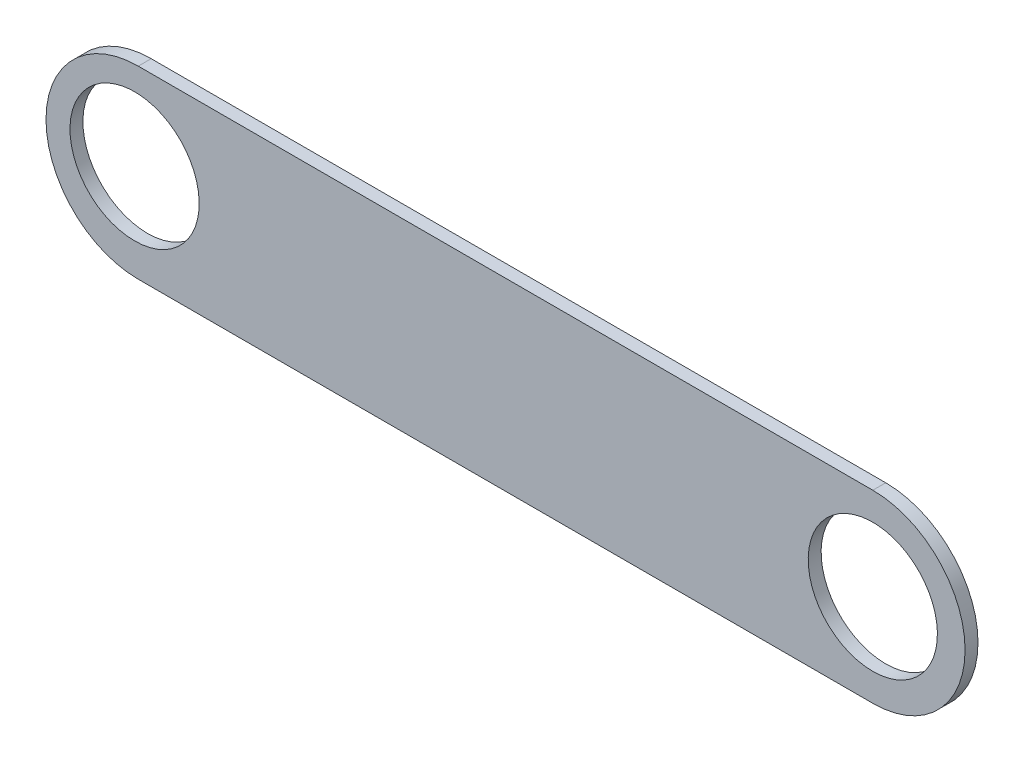
ISO-10303-21;
HEADER;
FILE_DESCRIPTION(('STEP AP214'),'2;1');
FILE_NAME('part.step','',(''),(''),'','','');
FILE_SCHEMA(('AUTOMOTIVE_DESIGN { 1 0 10303 214 1 1 1 1 }'));
ENDSEC;
DATA;
#1=APPLICATION_CONTEXT('core data for automotive mechanical design processes');
#2=APPLICATION_PROTOCOL_DEFINITION('international standard','automotive_design',2000,#1);
#3=PRODUCT_CONTEXT('',#1,'mechanical');
#4=PRODUCT('Part','Part','',(#3));
#5=PRODUCT_RELATED_PRODUCT_CATEGORY('part','',(#4));
#6=PRODUCT_DEFINITION_FORMATION('','',#4);
#7=PRODUCT_DEFINITION_CONTEXT('part definition',#1,'design');
#8=PRODUCT_DEFINITION('design','',#6,#7);
#9=PRODUCT_DEFINITION_SHAPE('','',#8);
#10=(LENGTH_UNIT() NAMED_UNIT(*) SI_UNIT(.MILLI.,.METRE.));
#11=(NAMED_UNIT(*) PLANE_ANGLE_UNIT() SI_UNIT($,.RADIAN.));
#12=(NAMED_UNIT(*) SI_UNIT($,.STERADIAN.) SOLID_ANGLE_UNIT());
#13=UNCERTAINTY_MEASURE_WITH_UNIT(LENGTH_MEASURE(1.E-05),#10,'distance_accuracy_value','');
#14=(GEOMETRIC_REPRESENTATION_CONTEXT(3) GLOBAL_UNCERTAINTY_ASSIGNED_CONTEXT((#13)) GLOBAL_UNIT_ASSIGNED_CONTEXT((#10,
#11,#12)) REPRESENTATION_CONTEXT('',''));
#15=CARTESIAN_POINT('',(0.,0.,0.));
#16=DIRECTION('',(0.,0.,1.));
#17=DIRECTION('',(1.,0.,0.));
#18=AXIS2_PLACEMENT_3D('',#15,#16,#17);
#19=CARTESIAN_POINT('',(95.66,-96.25,-0.045));
#20=DIRECTION('',(0.,0.,-1.));
#21=DIRECTION('',(0.,-1.,0.));
#22=AXIS2_PLACEMENT_3D('',#19,#20,#21);
#23=CYLINDRICAL_SURFACE('',#22,0.175);
#24=CARTESIAN_POINT('',(95.66,-96.25,-0.035));
#25=DIRECTION('',(0.,0.,-1.));
#26=DIRECTION('',(0.,-1.,0.));
#27=AXIS2_PLACEMENT_3D('',#24,#25,#26);
#28=CIRCLE('',#27,0.175);
#29=CARTESIAN_POINT('',(95.66,-96.425,-0.035));
#30=VERTEX_POINT('',#29);
#31=EDGE_CURVE('E132',#30,#30,#28,.T.);
#32=ORIENTED_EDGE('',*,*,#31,.T.);
#33=DIRECTION('',(0.,0.,1.));
#34=VECTOR('',#33,1.);
#35=CARTESIAN_POINT('',(95.66,-96.425,-0.045));
#36=LINE('',#35,#34);
#37=CARTESIAN_POINT('',(95.66,-96.425,0.));
#38=VERTEX_POINT('',#37);
#39=EDGE_CURVE('E11',#30,#38,#36,.T.);
#40=ORIENTED_EDGE('',*,*,#39,.T.);
#41=CARTESIAN_POINT('',(95.66,-96.25,0.));
#42=DIRECTION('',(0.,0.,-1.));
#43=DIRECTION('',(0.,-1.,0.));
#44=AXIS2_PLACEMENT_3D('',#41,#42,#43);
#45=CIRCLE('',#44,0.175);
#46=EDGE_CURVE('E135',#38,#38,#45,.T.);
#47=ORIENTED_EDGE('',*,*,#46,.F.);
#48=ORIENTED_EDGE('',*,*,#39,.F.);
#49=EDGE_LOOP('',(#32,#40,#47,#48));
#50=FACE_BOUND('',#49,.T.);
#51=ADVANCED_FACE('F17',(#50),#23,.F.);
#52=CARTESIAN_POINT('',(97.66,-96.26,-0.045));
#53=DIRECTION('',(0.,0.,-1.));
#54=DIRECTION('',(0.,-1.,0.));
#55=AXIS2_PLACEMENT_3D('',#52,#53,#54);
#56=CYLINDRICAL_SURFACE('',#55,0.175);
#57=CARTESIAN_POINT('',(97.66,-96.26,-0.035));
#58=DIRECTION('',(0.,0.,-1.));
#59=DIRECTION('',(0.,-1.,0.));
#60=AXIS2_PLACEMENT_3D('',#57,#58,#59);
#61=CIRCLE('',#60,0.175);
#62=CARTESIAN_POINT('',(97.66,-96.435,-0.035));
#63=VERTEX_POINT('',#62);
#64=EDGE_CURVE('E147',#63,#63,#61,.T.);
#65=ORIENTED_EDGE('',*,*,#64,.T.);
#66=DIRECTION('',(0.,0.,1.));
#67=VECTOR('',#66,1.);
#68=CARTESIAN_POINT('',(97.66,-96.435,-0.045));
#69=LINE('',#68,#67);
#70=CARTESIAN_POINT('',(97.66,-96.435,0.));
#71=VERTEX_POINT('',#70);
#72=EDGE_CURVE('E26',#63,#71,#69,.T.);
#73=ORIENTED_EDGE('',*,*,#72,.T.);
#74=CARTESIAN_POINT('',(97.66,-96.26,0.));
#75=DIRECTION('',(0.,0.,-1.));
#76=DIRECTION('',(0.,-1.,0.));
#77=AXIS2_PLACEMENT_3D('',#74,#75,#76);
#78=CIRCLE('',#77,0.175);
#79=EDGE_CURVE('E131',#71,#71,#78,.T.);
#80=ORIENTED_EDGE('',*,*,#79,.F.);
#81=ORIENTED_EDGE('',*,*,#72,.F.);
#82=EDGE_LOOP('',(#65,#73,#80,#81));
#83=FACE_BOUND('',#82,.T.);
#84=ADVANCED_FACE('F19',(#83),#56,.F.);
#85=CARTESIAN_POINT('',(95.67,-96.51,-0.035));
#86=DIRECTION('',(0.,1.,0.));
#87=DIRECTION('',(1.,0.,0.));
#88=AXIS2_PLACEMENT_3D('',#85,#86,#87);
#89=PLANE('',#88);
#90=DIRECTION('',(1.,0.,0.));
#91=VECTOR('',#90,1.);
#92=CARTESIAN_POINT('',(95.67,-96.51,-0.035));
#93=LINE('',#92,#91);
#94=CARTESIAN_POINT('',(95.67,-96.51,-0.035));
#95=VERTEX_POINT('',#94);
#96=CARTESIAN_POINT('',(97.66,-96.51,-0.035));
#97=VERTEX_POINT('',#96);
#98=EDGE_CURVE('E151',#95,#97,#93,.T.);
#99=ORIENTED_EDGE('',*,*,#98,.T.);
#100=DIRECTION('',(0.,0.,1.));
#101=VECTOR('',#100,1.);
#102=CARTESIAN_POINT('',(97.66,-96.51,-0.035));
#103=LINE('',#102,#101);
#104=CARTESIAN_POINT('',(97.66,-96.51,0.));
#105=VERTEX_POINT('',#104);
#106=EDGE_CURVE('E96',#97,#105,#103,.T.);
#107=ORIENTED_EDGE('',*,*,#106,.T.);
#108=DIRECTION('',(1.,0.,0.));
#109=VECTOR('',#108,1.);
#110=CARTESIAN_POINT('',(95.67,-96.51,0.));
#111=LINE('',#110,#109);
#112=CARTESIAN_POINT('',(95.67,-96.51,0.));
#113=VERTEX_POINT('',#112);
#114=EDGE_CURVE('E128',#113,#105,#111,.T.);
#115=ORIENTED_EDGE('',*,*,#114,.F.);
#116=DIRECTION('',(0.,0.,1.));
#117=VECTOR('',#116,1.);
#118=CARTESIAN_POINT('',(95.67,-96.51,-0.035));
#119=LINE('',#118,#117);
#120=EDGE_CURVE('E140',#95,#113,#119,.T.);
#121=ORIENTED_EDGE('',*,*,#120,.F.);
#122=EDGE_LOOP('',(#99,#107,#115,#121));
#123=FACE_BOUND('',#122,.T.);
#124=ADVANCED_FACE('F258',(#123),#89,.F.);
#125=CARTESIAN_POINT('',(97.66,-96.01,0.));
#126=DIRECTION('',(0.,0.,1.));
#127=DIRECTION('',(1.,0.,0.));
#128=AXIS2_PLACEMENT_3D('',#125,#126,#127);
#129=PLANE('',#128);
#130=ORIENTED_EDGE('',*,*,#46,.T.);
#131=EDGE_LOOP('',(#130));
#132=FACE_BOUND('',#131,.T.);
#133=ORIENTED_EDGE('',*,*,#79,.T.);
#134=EDGE_LOOP('',(#133));
#135=FACE_BOUND('',#134,.T.);
#136=DIRECTION('',(-1.,0.,0.));
#137=VECTOR('',#136,1.);
#138=CARTESIAN_POINT('',(97.66,-96.01,0.));
#139=LINE('',#138,#137);
#140=CARTESIAN_POINT('',(97.66,-96.01,0.));
#141=VERTEX_POINT('',#140);
#142=CARTESIAN_POINT('',(95.67,-96.01,0.));
#143=VERTEX_POINT('',#142);
#144=EDGE_CURVE('E108',#141,#143,#139,.T.);
#145=ORIENTED_EDGE('',*,*,#144,.T.);
#146=CARTESIAN_POINT('',(95.67,-96.26,0.));
#147=DIRECTION('',(0.,0.,1.));
#148=DIRECTION('',(0.,1.,0.));
#149=AXIS2_PLACEMENT_3D('',#146,#147,#148);
#150=CIRCLE('',#149,0.25);
#151=EDGE_CURVE('E144',#143,#113,#150,.T.);
#152=ORIENTED_EDGE('',*,*,#151,.T.);
#153=ORIENTED_EDGE('',*,*,#114,.T.);
#154=CARTESIAN_POINT('',(97.66,-96.26,0.));
#155=DIRECTION('',(0.,0.,1.));
#156=DIRECTION('',(0.,-1.,0.));
#157=AXIS2_PLACEMENT_3D('',#154,#155,#156);
#158=CIRCLE('',#157,0.25);
#159=EDGE_CURVE('E100',#105,#141,#158,.T.);
#160=ORIENTED_EDGE('',*,*,#159,.T.);
#161=EDGE_LOOP('',(#145,#152,#153,#160));
#162=FACE_BOUND('',#161,.T.);
#163=ADVANCED_FACE('F248',(#132,#135,#162),#129,.T.);
#164=CARTESIAN_POINT('',(97.66,-96.01,-0.035));
#165=DIRECTION('',(0.,0.,1.));
#166=DIRECTION('',(1.,0.,0.));
#167=AXIS2_PLACEMENT_3D('',#164,#165,#166);
#168=PLANE('',#167);
#169=ORIENTED_EDGE('',*,*,#31,.F.);
#170=EDGE_LOOP('',(#169));
#171=FACE_BOUND('',#170,.T.);
#172=ORIENTED_EDGE('',*,*,#64,.F.);
#173=EDGE_LOOP('',(#172));
#174=FACE_BOUND('',#173,.T.);
#175=CARTESIAN_POINT('',(97.66,-96.26,-0.035));
#176=DIRECTION('',(0.,0.,1.));
#177=DIRECTION('',(0.,-1.,0.));
#178=AXIS2_PLACEMENT_3D('',#175,#176,#177);
#179=CIRCLE('',#178,0.25);
#180=CARTESIAN_POINT('',(97.66,-96.01,-0.035));
#181=VERTEX_POINT('',#180);
#182=EDGE_CURVE('E89',#97,#181,#179,.T.);
#183=ORIENTED_EDGE('',*,*,#182,.F.);
#184=ORIENTED_EDGE('',*,*,#98,.F.);
#185=CARTESIAN_POINT('',(95.67,-96.26,-0.035));
#186=DIRECTION('',(0.,0.,1.));
#187=DIRECTION('',(0.,1.,0.));
#188=AXIS2_PLACEMENT_3D('',#185,#186,#187);
#189=CIRCLE('',#188,0.25);
#190=CARTESIAN_POINT('',(95.67,-96.01,-0.035));
#191=VERTEX_POINT('',#190);
#192=EDGE_CURVE('E113',#191,#95,#189,.T.);
#193=ORIENTED_EDGE('',*,*,#192,.F.);
#194=DIRECTION('',(-1.,0.,0.));
#195=VECTOR('',#194,1.);
#196=CARTESIAN_POINT('',(97.66,-96.01,-0.035));
#197=LINE('',#196,#195);
#198=EDGE_CURVE('E106',#181,#191,#197,.T.);
#199=ORIENTED_EDGE('',*,*,#198,.F.);
#200=EDGE_LOOP('',(#183,#184,#193,#199));
#201=FACE_BOUND('',#200,.T.);
#202=ADVANCED_FACE('F111',(#171,#174,#201),#168,.F.);
#203=CARTESIAN_POINT('',(95.67,-96.26,-0.035));
#204=DIRECTION('',(0.,0.,-1.));
#205=DIRECTION('',(0.,1.,0.));
#206=AXIS2_PLACEMENT_3D('',#203,#204,#205);
#207=CYLINDRICAL_SURFACE('',#206,0.25);
#208=ORIENTED_EDGE('',*,*,#192,.T.);
#209=ORIENTED_EDGE('',*,*,#120,.T.);
#210=ORIENTED_EDGE('',*,*,#151,.F.);
#211=DIRECTION('',(0.,0.,1.));
#212=VECTOR('',#211,1.);
#213=CARTESIAN_POINT('',(95.67,-96.01,-0.035));
#214=LINE('',#213,#212);
#215=EDGE_CURVE('E116',#191,#143,#214,.T.);
#216=ORIENTED_EDGE('',*,*,#215,.F.);
#217=EDGE_LOOP('',(#208,#209,#210,#216));
#218=FACE_BOUND('',#217,.T.);
#219=ADVANCED_FACE('F228',(#218),#207,.T.);
#220=CARTESIAN_POINT('',(97.66,-96.26,-0.035));
#221=DIRECTION('',(0.,0.,-1.));
#222=DIRECTION('',(0.,-1.,0.));
#223=AXIS2_PLACEMENT_3D('',#220,#221,#222);
#224=CYLINDRICAL_SURFACE('',#223,0.25);
#225=ORIENTED_EDGE('',*,*,#182,.T.);
#226=DIRECTION('',(0.,0.,1.));
#227=VECTOR('',#226,1.);
#228=CARTESIAN_POINT('',(97.66,-96.01,-0.035));
#229=LINE('',#228,#227);
#230=EDGE_CURVE('E93',#181,#141,#229,.T.);
#231=ORIENTED_EDGE('',*,*,#230,.T.);
#232=ORIENTED_EDGE('',*,*,#159,.F.);
#233=ORIENTED_EDGE('',*,*,#106,.F.);
#234=EDGE_LOOP('',(#225,#231,#232,#233));
#235=FACE_BOUND('',#234,.T.);
#236=ADVANCED_FACE('F91',(#235),#224,.T.);
#237=CARTESIAN_POINT('',(97.66,-96.01,-0.035));
#238=DIRECTION('',(0.,-1.,0.));
#239=DIRECTION('',(0.,0.,-1.));
#240=AXIS2_PLACEMENT_3D('',#237,#238,#239);
#241=PLANE('',#240);
#242=ORIENTED_EDGE('',*,*,#198,.T.);
#243=ORIENTED_EDGE('',*,*,#215,.T.);
#244=ORIENTED_EDGE('',*,*,#144,.F.);
#245=ORIENTED_EDGE('',*,*,#230,.F.);
#246=EDGE_LOOP('',(#242,#243,#244,#245));
#247=FACE_BOUND('',#246,.T.);
#248=ADVANCED_FACE('F104',(#247),#241,.F.);
#249=CLOSED_SHELL('',(#51,#84,#124,#163,#202,#219,#236,#248));
#250=MANIFOLD_SOLID_BREP('B1',#249);
#251=ADVANCED_BREP_SHAPE_REPRESENTATION('',(#18,#250),#14);
#252=SHAPE_DEFINITION_REPRESENTATION(#9,#251);
ENDSEC;
END-ISO-10303-21;
